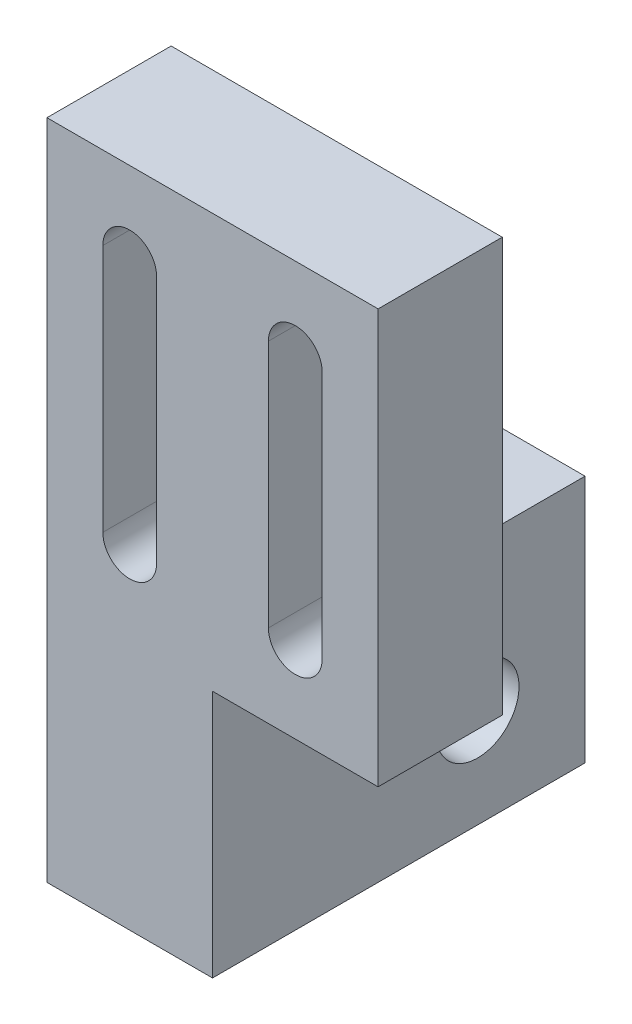
ISO-10303-21;
HEADER;
FILE_DESCRIPTION(('STEP AP214'),'2;1');
FILE_NAME('part.step','',(''),(''),'','','');
FILE_SCHEMA(('AUTOMOTIVE_DESIGN { 1 0 10303 214 1 1 1 1 }'));
ENDSEC;
DATA;
#1=APPLICATION_CONTEXT('core data for automotive mechanical design processes');
#2=APPLICATION_PROTOCOL_DEFINITION('international standard','automotive_design',2000,#1);
#3=PRODUCT_CONTEXT('',#1,'mechanical');
#4=PRODUCT('Part','Part','',(#3));
#5=PRODUCT_RELATED_PRODUCT_CATEGORY('part','',(#4));
#6=PRODUCT_DEFINITION_FORMATION('','',#4);
#7=PRODUCT_DEFINITION_CONTEXT('part definition',#1,'design');
#8=PRODUCT_DEFINITION('design','',#6,#7);
#9=PRODUCT_DEFINITION_SHAPE('','',#8);
#10=(LENGTH_UNIT() NAMED_UNIT(*) SI_UNIT(.MILLI.,.METRE.));
#11=(NAMED_UNIT(*) PLANE_ANGLE_UNIT() SI_UNIT($,.RADIAN.));
#12=(NAMED_UNIT(*) SI_UNIT($,.STERADIAN.) SOLID_ANGLE_UNIT());
#13=UNCERTAINTY_MEASURE_WITH_UNIT(LENGTH_MEASURE(1.E-05),#10,'distance_accuracy_value','');
#14=(GEOMETRIC_REPRESENTATION_CONTEXT(3) GLOBAL_UNCERTAINTY_ASSIGNED_CONTEXT((#13)) GLOBAL_UNIT_ASSIGNED_CONTEXT((#10,
#11,#12)) REPRESENTATION_CONTEXT('',''));
#15=CARTESIAN_POINT('',(0.,0.,0.));
#16=DIRECTION('',(0.,0.,1.));
#17=DIRECTION('',(1.,0.,0.));
#18=AXIS2_PLACEMENT_3D('',#15,#16,#17);
#19=CARTESIAN_POINT('',(-84.6,6.27000000000013,-9.));
#20=DIRECTION('',(0.,-1.,0.));
#21=DIRECTION('',(0.,0.,1.));
#22=AXIS2_PLACEMENT_3D('',#19,#20,#21);
#23=PLANE('',#22);
#24=DIRECTION('',(1.,0.,0.));
#25=VECTOR('',#24,1.);
#26=CARTESIAN_POINT('',(-84.6,6.27000000000013,-3.));
#27=LINE('',#26,#25);
#28=CARTESIAN_POINT('',(-84.6,6.27000000000013,-3.));
#29=VERTEX_POINT('',#28);
#30=CARTESIAN_POINT('',(-80.6,6.27000000000013,-3.));
#31=VERTEX_POINT('',#30);
#32=EDGE_CURVE('E226',#29,#31,#27,.T.);
#33=ORIENTED_EDGE('',*,*,#32,.T.);
#34=DIRECTION('',(0.,0.,1.));
#35=VECTOR('',#34,1.);
#36=CARTESIAN_POINT('',(-80.6,6.27000000000013,-9.));
#37=LINE('',#36,#35);
#38=CARTESIAN_POINT('',(-80.6,6.27000000000013,-9.));
#39=VERTEX_POINT('',#38);
#40=EDGE_CURVE('E272',#39,#31,#37,.T.);
#41=ORIENTED_EDGE('',*,*,#40,.F.);
#42=DIRECTION('',(-1.,0.,0.));
#43=VECTOR('',#42,1.);
#44=CARTESIAN_POINT('',(-84.6,6.27000000000013,-9.));
#45=LINE('',#44,#43);
#46=CARTESIAN_POINT('',(-84.6,6.27000000000013,-9.));
#47=VERTEX_POINT('',#46);
#48=EDGE_CURVE('E258',#39,#47,#45,.T.);
#49=ORIENTED_EDGE('',*,*,#48,.T.);
#50=DIRECTION('',(0.,0.,1.));
#51=VECTOR('',#50,1.);
#52=CARTESIAN_POINT('',(-84.6,6.27000000000013,-9.));
#53=LINE('',#52,#51);
#54=EDGE_CURVE('E261',#47,#29,#53,.T.);
#55=ORIENTED_EDGE('',*,*,#54,.T.);
#56=EDGE_LOOP('',(#33,#41,#49,#55));
#57=FACE_BOUND('',#56,.T.);
#58=ADVANCED_FACE('F37',(#57),#23,.F.);
#59=CARTESIAN_POINT('',(-84.6,6.27000000000013,-9.));
#60=DIRECTION('',(1.,0.,0.));
#61=DIRECTION('',(0.,0.,1.));
#62=AXIS2_PLACEMENT_3D('',#59,#60,#61);
#63=PLANE('',#62);
#64=CARTESIAN_POINT('',(-84.6,2.67000000000013,-6.40499999999975));
#65=DIRECTION('',(1.,0.,0.));
#66=DIRECTION('',(0.,0.,-1.));
#67=AXIS2_PLACEMENT_3D('',#64,#65,#66);
#68=CIRCLE('',#67,1.);
#69=CARTESIAN_POINT('',(-84.6,2.67000000000013,-7.40499999999975));
#70=VERTEX_POINT('',#69);
#71=EDGE_CURVE('E188',#70,#70,#68,.T.);
#72=ORIENTED_EDGE('',*,*,#71,.T.);
#73=EDGE_LOOP('',(#72));
#74=FACE_BOUND('',#73,.T.);
#75=DIRECTION('',(0.,-1.,0.));
#76=VECTOR('',#75,1.);
#77=CARTESIAN_POINT('',(-84.6,6.27000000000013,0.));
#78=LINE('',#77,#76);
#79=CARTESIAN_POINT('',(-84.6,16.2700000000001,0.));
#80=VERTEX_POINT('',#79);
#81=CARTESIAN_POINT('',(-84.6,0.270000000000126,0.));
#82=VERTEX_POINT('',#81);
#83=EDGE_CURVE('E248',#80,#82,#78,.T.);
#84=ORIENTED_EDGE('',*,*,#83,.F.);
#85=DIRECTION('',(0.,0.,1.));
#86=VECTOR('',#85,1.);
#87=CARTESIAN_POINT('',(-84.6,16.2700000000001,-3.));
#88=LINE('',#87,#86);
#89=CARTESIAN_POINT('',(-84.6,16.2700000000001,-3.));
#90=VERTEX_POINT('',#89);
#91=EDGE_CURVE('E234',#90,#80,#88,.T.);
#92=ORIENTED_EDGE('',*,*,#91,.F.);
#93=DIRECTION('',(0.,-1.,0.));
#94=VECTOR('',#93,1.);
#95=CARTESIAN_POINT('',(-84.6,6.27000000000013,-3.));
#96=LINE('',#95,#94);
#97=EDGE_CURVE('E222',#90,#29,#96,.T.);
#98=ORIENTED_EDGE('',*,*,#97,.T.);
#99=ORIENTED_EDGE('',*,*,#54,.F.);
#100=DIRECTION('',(0.,-1.,0.));
#101=VECTOR('',#100,1.);
#102=CARTESIAN_POINT('',(-84.6,6.27000000000013,-9.));
#103=LINE('',#102,#101);
#104=CARTESIAN_POINT('',(-84.6,0.270000000000126,-9.));
#105=VERTEX_POINT('',#104);
#106=EDGE_CURVE('E249',#47,#105,#103,.T.);
#107=ORIENTED_EDGE('',*,*,#106,.T.);
#108=DIRECTION('',(0.,0.,1.));
#109=VECTOR('',#108,1.);
#110=CARTESIAN_POINT('',(-84.6,0.270000000000126,-9.));
#111=LINE('',#110,#109);
#112=EDGE_CURVE('E11',#105,#82,#111,.T.);
#113=ORIENTED_EDGE('',*,*,#112,.T.);
#114=EDGE_LOOP('',(#84,#92,#98,#99,#107,#113));
#115=FACE_BOUND('',#114,.T.);
#116=ADVANCED_FACE('F39',(#74,#115),#63,.F.);
#117=CARTESIAN_POINT('',(-84.6,0.270000000000126,-9.));
#118=DIRECTION('',(0.,1.,0.));
#119=DIRECTION('',(0.,0.,-1.));
#120=AXIS2_PLACEMENT_3D('',#117,#118,#119);
#121=PLANE('',#120);
#122=DIRECTION('',(1.,0.,0.));
#123=VECTOR('',#122,1.);
#124=CARTESIAN_POINT('',(-84.6,0.270000000000126,0.));
#125=LINE('',#124,#123);
#126=CARTESIAN_POINT('',(-80.6,0.270000000000126,0.));
#127=VERTEX_POINT('',#126);
#128=EDGE_CURVE('E264',#82,#127,#125,.T.);
#129=ORIENTED_EDGE('',*,*,#128,.F.);
#130=ORIENTED_EDGE('',*,*,#112,.F.);
#131=DIRECTION('',(1.,0.,0.));
#132=VECTOR('',#131,1.);
#133=CARTESIAN_POINT('',(-84.6,0.270000000000126,-9.));
#134=LINE('',#133,#132);
#135=CARTESIAN_POINT('',(-80.6,0.270000000000126,-9.));
#136=VERTEX_POINT('',#135);
#137=EDGE_CURVE('E252',#105,#136,#134,.T.);
#138=ORIENTED_EDGE('',*,*,#137,.T.);
#139=DIRECTION('',(0.,0.,1.));
#140=VECTOR('',#139,1.);
#141=CARTESIAN_POINT('',(-80.6,0.270000000000126,-9.));
#142=LINE('',#141,#140);
#143=EDGE_CURVE('E46',#136,#127,#142,.T.);
#144=ORIENTED_EDGE('',*,*,#143,.T.);
#145=EDGE_LOOP('',(#129,#130,#138,#144));
#146=FACE_BOUND('',#145,.T.);
#147=ADVANCED_FACE('F278',(#146),#121,.F.);
#148=CARTESIAN_POINT('',(-80.6,6.27000000000013,-9.));
#149=DIRECTION('',(-1.,0.,0.));
#150=DIRECTION('',(0.,0.,-1.));
#151=AXIS2_PLACEMENT_3D('',#148,#149,#150);
#152=PLANE('',#151);
#153=CARTESIAN_POINT('',(-80.6,2.67000000000013,-6.40499999999975));
#154=DIRECTION('',(1.,0.,0.));
#155=DIRECTION('',(0.,0.,-1.));
#156=AXIS2_PLACEMENT_3D('',#153,#154,#155);
#157=CIRCLE('',#156,1.);
#158=CARTESIAN_POINT('',(-80.6,2.67000000000013,-7.40499999999975));
#159=VERTEX_POINT('',#158);
#160=EDGE_CURVE('E41',#159,#159,#157,.T.);
#161=ORIENTED_EDGE('',*,*,#160,.F.);
#162=EDGE_LOOP('',(#161));
#163=FACE_BOUND('',#162,.T.);
#164=DIRECTION('',(0.,1.,0.));
#165=VECTOR('',#164,1.);
#166=CARTESIAN_POINT('',(-80.6,6.27000000000013,0.));
#167=LINE('',#166,#165);
#168=CARTESIAN_POINT('',(-80.6,6.27000000000013,0.));
#169=VERTEX_POINT('',#168);
#170=EDGE_CURVE('E253',#127,#169,#167,.T.);
#171=ORIENTED_EDGE('',*,*,#170,.F.);
#172=ORIENTED_EDGE('',*,*,#143,.F.);
#173=DIRECTION('',(0.,1.,0.));
#174=VECTOR('',#173,1.);
#175=CARTESIAN_POINT('',(-80.6,6.27000000000013,-9.));
#176=LINE('',#175,#174);
#177=EDGE_CURVE('E256',#136,#39,#176,.T.);
#178=ORIENTED_EDGE('',*,*,#177,.T.);
#179=ORIENTED_EDGE('',*,*,#40,.T.);
#180=EDGE_CURVE('E271',#31,#169,#37,.T.);
#181=ORIENTED_EDGE('',*,*,#180,.T.);
#182=EDGE_LOOP('',(#171,#172,#178,#179,#181));
#183=FACE_BOUND('',#182,.T.);
#184=ADVANCED_FACE('F291',(#163,#183),#152,.F.);
#185=CARTESIAN_POINT('',(0.,0.,-9.));
#186=DIRECTION('',(0.,0.,-1.));
#187=DIRECTION('',(1.,0.,0.));
#188=AXIS2_PLACEMENT_3D('',#185,#186,#187);
#189=PLANE('',#188);
#190=ORIENTED_EDGE('',*,*,#106,.F.);
#191=ORIENTED_EDGE('',*,*,#48,.F.);
#192=ORIENTED_EDGE('',*,*,#177,.F.);
#193=ORIENTED_EDGE('',*,*,#137,.F.);
#194=EDGE_LOOP('',(#190,#191,#192,#193));
#195=FACE_BOUND('',#194,.T.);
#196=ADVANCED_FACE('F289',(#195),#189,.T.);
#197=CARTESIAN_POINT('',(0.,0.,0.));
#198=DIRECTION('',(0.,0.,-1.));
#199=DIRECTION('',(1.,0.,0.));
#200=AXIS2_PLACEMENT_3D('',#197,#198,#199);
#201=PLANE('',#200);
#202=DIRECTION('',(0.,-1.,0.));
#203=VECTOR('',#202,1.);
#204=CARTESIAN_POINT('',(-83.25,8.27000000000013,0.));
#205=LINE('',#204,#203);
#206=CARTESIAN_POINT('',(-83.25,14.2700000000001,0.));
#207=VERTEX_POINT('',#206);
#208=CARTESIAN_POINT('',(-83.25,8.27000000000013,0.));
#209=VERTEX_POINT('',#208);
#210=EDGE_CURVE('E160',#207,#209,#205,.T.);
#211=ORIENTED_EDGE('',*,*,#210,.F.);
#212=CARTESIAN_POINT('',(-82.6,14.2700000000001,0.));
#213=DIRECTION('',(0.,0.,1.));
#214=DIRECTION('',(1.,0.,0.));
#215=AXIS2_PLACEMENT_3D('',#212,#213,#214);
#216=CIRCLE('',#215,0.649999999999998);
#217=CARTESIAN_POINT('',(-81.95,14.2700000000001,0.));
#218=VERTEX_POINT('',#217);
#219=EDGE_CURVE('E173',#218,#207,#216,.T.);
#220=ORIENTED_EDGE('',*,*,#219,.F.);
#221=DIRECTION('',(0.,1.,0.));
#222=VECTOR('',#221,1.);
#223=CARTESIAN_POINT('',(-81.95,8.27000000000013,0.));
#224=LINE('',#223,#222);
#225=CARTESIAN_POINT('',(-81.95,8.27000000000013,0.));
#226=VERTEX_POINT('',#225);
#227=EDGE_CURVE('E153',#226,#218,#224,.T.);
#228=ORIENTED_EDGE('',*,*,#227,.F.);
#229=CARTESIAN_POINT('',(-82.6,8.27000000000013,0.));
#230=DIRECTION('',(0.,0.,1.));
#231=DIRECTION('',(1.,0.,0.));
#232=AXIS2_PLACEMENT_3D('',#229,#230,#231);
#233=CIRCLE('',#232,0.649999999999998);
#234=EDGE_CURVE('E163',#209,#226,#233,.T.);
#235=ORIENTED_EDGE('',*,*,#234,.F.);
#236=EDGE_LOOP('',(#211,#220,#228,#235));
#237=FACE_BOUND('',#236,.T.);
#238=DIRECTION('',(0.,1.,0.));
#239=VECTOR('',#238,1.);
#240=CARTESIAN_POINT('',(-77.95,14.2700000000001,0.));
#241=LINE('',#240,#239);
#242=CARTESIAN_POINT('',(-77.95,8.27000000000013,0.));
#243=VERTEX_POINT('',#242);
#244=CARTESIAN_POINT('',(-77.95,14.2700000000001,0.));
#245=VERTEX_POINT('',#244);
#246=EDGE_CURVE('E200',#243,#245,#241,.T.);
#247=ORIENTED_EDGE('',*,*,#246,.F.);
#248=CARTESIAN_POINT('',(-78.6,8.27000000000013,0.));
#249=DIRECTION('',(0.,0.,1.));
#250=DIRECTION('',(1.,0.,0.));
#251=AXIS2_PLACEMENT_3D('',#248,#249,#250);
#252=CIRCLE('',#251,0.649999999999998);
#253=CARTESIAN_POINT('',(-79.25,8.27000000000013,0.));
#254=VERTEX_POINT('',#253);
#255=EDGE_CURVE('E198',#254,#243,#252,.T.);
#256=ORIENTED_EDGE('',*,*,#255,.F.);
#257=DIRECTION('',(0.,-1.,0.));
#258=VECTOR('',#257,1.);
#259=CARTESIAN_POINT('',(-79.25,14.2700000000001,0.));
#260=LINE('',#259,#258);
#261=CARTESIAN_POINT('',(-79.25,14.2700000000001,0.));
#262=VERTEX_POINT('',#261);
#263=EDGE_CURVE('E195',#262,#254,#260,.T.);
#264=ORIENTED_EDGE('',*,*,#263,.F.);
#265=CARTESIAN_POINT('',(-78.6,14.2700000000001,0.));
#266=DIRECTION('',(0.,0.,1.));
#267=DIRECTION('',(1.,0.,0.));
#268=AXIS2_PLACEMENT_3D('',#265,#266,#267);
#269=CIRCLE('',#268,0.649999999999998);
#270=EDGE_CURVE('E192',#245,#262,#269,.T.);
#271=ORIENTED_EDGE('',*,*,#270,.F.);
#272=EDGE_LOOP('',(#247,#256,#264,#271));
#273=FACE_BOUND('',#272,.T.);
#274=ORIENTED_EDGE('',*,*,#83,.T.);
#275=ORIENTED_EDGE('',*,*,#128,.T.);
#276=ORIENTED_EDGE('',*,*,#170,.T.);
#277=DIRECTION('',(1.,0.,0.));
#278=VECTOR('',#277,1.);
#279=CARTESIAN_POINT('',(-84.6,6.27000000000013,0.));
#280=LINE('',#279,#278);
#281=CARTESIAN_POINT('',(-76.6,6.27000000000013,0.));
#282=VERTEX_POINT('',#281);
#283=EDGE_CURVE('E235',#169,#282,#280,.T.);
#284=ORIENTED_EDGE('',*,*,#283,.T.);
#285=DIRECTION('',(0.,1.,0.));
#286=VECTOR('',#285,1.);
#287=CARTESIAN_POINT('',(-76.6,6.27000000000013,0.));
#288=LINE('',#287,#286);
#289=CARTESIAN_POINT('',(-76.6,16.2700000000001,0.));
#290=VERTEX_POINT('',#289);
#291=EDGE_CURVE('E238',#282,#290,#288,.T.);
#292=ORIENTED_EDGE('',*,*,#291,.T.);
#293=DIRECTION('',(-1.,0.,0.));
#294=VECTOR('',#293,1.);
#295=CARTESIAN_POINT('',(-84.6,16.2700000000001,0.));
#296=LINE('',#295,#294);
#297=EDGE_CURVE('E225',#290,#80,#296,.T.);
#298=ORIENTED_EDGE('',*,*,#297,.T.);
#299=EDGE_LOOP('',(#274,#275,#276,#284,#292,#298));
#300=FACE_BOUND('',#299,.T.);
#301=ADVANCED_FACE('F171',(#237,#273,#300),#201,.F.);
#302=CARTESIAN_POINT('',(-84.6,6.27000000000013,-3.));
#303=DIRECTION('',(0.,1.,0.));
#304=DIRECTION('',(0.,0.,-1.));
#305=AXIS2_PLACEMENT_3D('',#302,#303,#304);
#306=PLANE('',#305);
#307=CARTESIAN_POINT('',(-76.6,6.27000000000013,-3.));
#308=VERTEX_POINT('',#307);
#309=EDGE_CURVE('E224',#31,#308,#27,.T.);
#310=ORIENTED_EDGE('',*,*,#309,.T.);
#311=DIRECTION('',(0.,0.,1.));
#312=VECTOR('',#311,1.);
#313=CARTESIAN_POINT('',(-76.6,6.27000000000013,-3.));
#314=LINE('',#313,#312);
#315=EDGE_CURVE('E246',#308,#282,#314,.T.);
#316=ORIENTED_EDGE('',*,*,#315,.T.);
#317=ORIENTED_EDGE('',*,*,#283,.F.);
#318=ORIENTED_EDGE('',*,*,#180,.F.);
#319=EDGE_LOOP('',(#310,#316,#317,#318));
#320=FACE_BOUND('',#319,.T.);
#321=ADVANCED_FACE('F302',(#320),#306,.F.);
#322=CARTESIAN_POINT('',(-76.6,6.27000000000013,-3.));
#323=DIRECTION('',(-1.,0.,0.));
#324=DIRECTION('',(0.,0.,-1.));
#325=AXIS2_PLACEMENT_3D('',#322,#323,#324);
#326=PLANE('',#325);
#327=ORIENTED_EDGE('',*,*,#291,.F.);
#328=ORIENTED_EDGE('',*,*,#315,.F.);
#329=DIRECTION('',(0.,1.,0.));
#330=VECTOR('',#329,1.);
#331=CARTESIAN_POINT('',(-76.6,6.27000000000013,-3.));
#332=LINE('',#331,#330);
#333=CARTESIAN_POINT('',(-76.6,16.2700000000001,-3.));
#334=VERTEX_POINT('',#333);
#335=EDGE_CURVE('E229',#308,#334,#332,.T.);
#336=ORIENTED_EDGE('',*,*,#335,.T.);
#337=DIRECTION('',(0.,0.,1.));
#338=VECTOR('',#337,1.);
#339=CARTESIAN_POINT('',(-76.6,16.2700000000001,-3.));
#340=LINE('',#339,#338);
#341=EDGE_CURVE('E244',#334,#290,#340,.T.);
#342=ORIENTED_EDGE('',*,*,#341,.T.);
#343=EDGE_LOOP('',(#327,#328,#336,#342));
#344=FACE_BOUND('',#343,.T.);
#345=ADVANCED_FACE('F305',(#344),#326,.F.);
#346=CARTESIAN_POINT('',(-84.6,16.2700000000001,-3.));
#347=DIRECTION('',(0.,-1.,0.));
#348=DIRECTION('',(0.,0.,1.));
#349=AXIS2_PLACEMENT_3D('',#346,#347,#348);
#350=PLANE('',#349);
#351=ORIENTED_EDGE('',*,*,#297,.F.);
#352=ORIENTED_EDGE('',*,*,#341,.F.);
#353=DIRECTION('',(-1.,0.,0.));
#354=VECTOR('',#353,1.);
#355=CARTESIAN_POINT('',(-84.6,16.2700000000001,-3.));
#356=LINE('',#355,#354);
#357=EDGE_CURVE('E232',#334,#90,#356,.T.);
#358=ORIENTED_EDGE('',*,*,#357,.T.);
#359=ORIENTED_EDGE('',*,*,#91,.T.);
#360=EDGE_LOOP('',(#351,#352,#358,#359));
#361=FACE_BOUND('',#360,.T.);
#362=ADVANCED_FACE('F308',(#361),#350,.F.);
#363=CARTESIAN_POINT('',(0.,0.,-3.));
#364=DIRECTION('',(0.,0.,1.));
#365=DIRECTION('',(-1.,0.,0.));
#366=AXIS2_PLACEMENT_3D('',#363,#364,#365);
#367=PLANE('',#366);
#368=DIRECTION('',(0.,1.,0.));
#369=VECTOR('',#368,1.);
#370=CARTESIAN_POINT('',(-81.95,8.27000000000013,-3.));
#371=LINE('',#370,#369);
#372=CARTESIAN_POINT('',(-81.95,8.27000000000013,-3.));
#373=VERTEX_POINT('',#372);
#374=CARTESIAN_POINT('',(-81.95,14.2700000000001,-3.));
#375=VERTEX_POINT('',#374);
#376=EDGE_CURVE('E156',#373,#375,#371,.T.);
#377=ORIENTED_EDGE('',*,*,#376,.T.);
#378=CARTESIAN_POINT('',(-82.6,14.2700000000001,-3.));
#379=DIRECTION('',(0.,0.,1.));
#380=DIRECTION('',(1.,0.,0.));
#381=AXIS2_PLACEMENT_3D('',#378,#379,#380);
#382=CIRCLE('',#381,0.649999999999998);
#383=CARTESIAN_POINT('',(-83.25,14.2700000000001,-3.));
#384=VERTEX_POINT('',#383);
#385=EDGE_CURVE('E182',#375,#384,#382,.T.);
#386=ORIENTED_EDGE('',*,*,#385,.T.);
#387=DIRECTION('',(0.,-1.,0.));
#388=VECTOR('',#387,1.);
#389=CARTESIAN_POINT('',(-83.25,8.27000000000013,-3.));
#390=LINE('',#389,#388);
#391=CARTESIAN_POINT('',(-83.25,8.27000000000013,-3.));
#392=VERTEX_POINT('',#391);
#393=EDGE_CURVE('E169',#384,#392,#390,.T.);
#394=ORIENTED_EDGE('',*,*,#393,.T.);
#395=CARTESIAN_POINT('',(-82.6,8.27000000000013,-3.));
#396=DIRECTION('',(0.,0.,1.));
#397=DIRECTION('',(1.,0.,0.));
#398=AXIS2_PLACEMENT_3D('',#395,#396,#397);
#399=CIRCLE('',#398,0.649999999999998);
#400=EDGE_CURVE('E178',#392,#373,#399,.T.);
#401=ORIENTED_EDGE('',*,*,#400,.T.);
#402=EDGE_LOOP('',(#377,#386,#394,#401));
#403=FACE_BOUND('',#402,.T.);
#404=DIRECTION('',(0.,-1.,0.));
#405=VECTOR('',#404,1.);
#406=CARTESIAN_POINT('',(-79.25,14.2700000000001,-3.));
#407=LINE('',#406,#405);
#408=CARTESIAN_POINT('',(-79.25,14.2700000000001,-3.));
#409=VERTEX_POINT('',#408);
#410=CARTESIAN_POINT('',(-79.25,8.27000000000013,-3.));
#411=VERTEX_POINT('',#410);
#412=EDGE_CURVE('E207',#409,#411,#407,.T.);
#413=ORIENTED_EDGE('',*,*,#412,.T.);
#414=CARTESIAN_POINT('',(-78.6,8.27000000000013,-3.));
#415=DIRECTION('',(0.,0.,1.));
#416=DIRECTION('',(1.,0.,0.));
#417=AXIS2_PLACEMENT_3D('',#414,#415,#416);
#418=CIRCLE('',#417,0.649999999999998);
#419=CARTESIAN_POINT('',(-77.95,8.27000000000013,-3.));
#420=VERTEX_POINT('',#419);
#421=EDGE_CURVE('E210',#411,#420,#418,.T.);
#422=ORIENTED_EDGE('',*,*,#421,.T.);
#423=DIRECTION('',(0.,1.,0.));
#424=VECTOR('',#423,1.);
#425=CARTESIAN_POINT('',(-77.95,14.2700000000001,-3.));
#426=LINE('',#425,#424);
#427=CARTESIAN_POINT('',(-77.95,14.2700000000001,-3.));
#428=VERTEX_POINT('',#427);
#429=EDGE_CURVE('E196',#420,#428,#426,.T.);
#430=ORIENTED_EDGE('',*,*,#429,.T.);
#431=CARTESIAN_POINT('',(-78.6,14.2700000000001,-3.));
#432=DIRECTION('',(0.,0.,1.));
#433=DIRECTION('',(1.,0.,0.));
#434=AXIS2_PLACEMENT_3D('',#431,#432,#433);
#435=CIRCLE('',#434,0.649999999999998);
#436=EDGE_CURVE('E204',#428,#409,#435,.T.);
#437=ORIENTED_EDGE('',*,*,#436,.T.);
#438=EDGE_LOOP('',(#413,#422,#430,#437));
#439=FACE_BOUND('',#438,.T.);
#440=ORIENTED_EDGE('',*,*,#97,.F.);
#441=ORIENTED_EDGE('',*,*,#357,.F.);
#442=ORIENTED_EDGE('',*,*,#335,.F.);
#443=ORIENTED_EDGE('',*,*,#309,.F.);
#444=ORIENTED_EDGE('',*,*,#32,.F.);
#445=EDGE_LOOP('',(#440,#441,#442,#443,#444));
#446=FACE_BOUND('',#445,.T.);
#447=ADVANCED_FACE('F298',(#403,#439,#446),#367,.F.);
#448=CARTESIAN_POINT('',(-76.6,2.67000000000013,-6.40499999999975));
#449=DIRECTION('',(-1.,0.,0.));
#450=DIRECTION('',(0.,0.,-1.));
#451=AXIS2_PLACEMENT_3D('',#448,#449,#450);
#452=CYLINDRICAL_SURFACE('',#451,1.);
#453=ORIENTED_EDGE('',*,*,#71,.F.);
#454=EDGE_LOOP('',(#453));
#455=FACE_BOUND('',#454,.T.);
#456=ORIENTED_EDGE('',*,*,#160,.T.);
#457=EDGE_LOOP('',(#456));
#458=FACE_BOUND('',#457,.T.);
#459=ADVANCED_FACE('F315',(#455,#458),#452,.F.);
#460=CARTESIAN_POINT('',(-78.6,14.2700000000001,0.));
#461=DIRECTION('',(0.,0.,-1.));
#462=DIRECTION('',(1.,0.,0.));
#463=AXIS2_PLACEMENT_3D('',#460,#461,#462);
#464=CYLINDRICAL_SURFACE('',#463,0.649999999999998);
#465=ORIENTED_EDGE('',*,*,#436,.F.);
#466=DIRECTION('',(0.,0.,-1.));
#467=VECTOR('',#466,1.);
#468=CARTESIAN_POINT('',(-77.95,14.2700000000001,0.));
#469=LINE('',#468,#467);
#470=EDGE_CURVE('E180',#245,#428,#469,.T.);
#471=ORIENTED_EDGE('',*,*,#470,.F.);
#472=ORIENTED_EDGE('',*,*,#270,.T.);
#473=DIRECTION('',(0.,0.,-1.));
#474=VECTOR('',#473,1.);
#475=CARTESIAN_POINT('',(-79.25,14.2700000000001,0.));
#476=LINE('',#475,#474);
#477=EDGE_CURVE('E203',#262,#409,#476,.T.);
#478=ORIENTED_EDGE('',*,*,#477,.T.);
#479=EDGE_LOOP('',(#465,#471,#472,#478));
#480=FACE_BOUND('',#479,.T.);
#481=ADVANCED_FACE('F379',(#480),#464,.F.);
#482=CARTESIAN_POINT('',(-77.95,14.2700000000001,0.));
#483=DIRECTION('',(1.,0.,0.));
#484=DIRECTION('',(0.,0.,1.));
#485=AXIS2_PLACEMENT_3D('',#482,#483,#484);
#486=PLANE('',#485);
#487=ORIENTED_EDGE('',*,*,#429,.F.);
#488=DIRECTION('',(0.,0.,-1.));
#489=VECTOR('',#488,1.);
#490=CARTESIAN_POINT('',(-77.95,8.27000000000013,0.));
#491=LINE('',#490,#489);
#492=EDGE_CURVE('E216',#243,#420,#491,.T.);
#493=ORIENTED_EDGE('',*,*,#492,.F.);
#494=ORIENTED_EDGE('',*,*,#246,.T.);
#495=ORIENTED_EDGE('',*,*,#470,.T.);
#496=EDGE_LOOP('',(#487,#493,#494,#495));
#497=FACE_BOUND('',#496,.T.);
#498=ADVANCED_FACE('F389',(#497),#486,.F.);
#499=CARTESIAN_POINT('',(-78.6,8.27000000000013,0.));
#500=DIRECTION('',(0.,0.,-1.));
#501=DIRECTION('',(1.,0.,0.));
#502=AXIS2_PLACEMENT_3D('',#499,#500,#501);
#503=CYLINDRICAL_SURFACE('',#502,0.649999999999998);
#504=ORIENTED_EDGE('',*,*,#421,.F.);
#505=DIRECTION('',(0.,0.,-1.));
#506=VECTOR('',#505,1.);
#507=CARTESIAN_POINT('',(-79.25,8.27000000000013,0.));
#508=LINE('',#507,#506);
#509=EDGE_CURVE('E61',#254,#411,#508,.T.);
#510=ORIENTED_EDGE('',*,*,#509,.F.);
#511=ORIENTED_EDGE('',*,*,#255,.T.);
#512=ORIENTED_EDGE('',*,*,#492,.T.);
#513=EDGE_LOOP('',(#504,#510,#511,#512));
#514=FACE_BOUND('',#513,.T.);
#515=ADVANCED_FACE('F399',(#514),#503,.F.);
#516=CARTESIAN_POINT('',(-79.25,14.2700000000001,0.));
#517=DIRECTION('',(-1.,0.,0.));
#518=DIRECTION('',(0.,0.,-1.));
#519=AXIS2_PLACEMENT_3D('',#516,#517,#518);
#520=PLANE('',#519);
#521=ORIENTED_EDGE('',*,*,#412,.F.);
#522=ORIENTED_EDGE('',*,*,#477,.F.);
#523=ORIENTED_EDGE('',*,*,#263,.T.);
#524=ORIENTED_EDGE('',*,*,#509,.T.);
#525=EDGE_LOOP('',(#521,#522,#523,#524));
#526=FACE_BOUND('',#525,.T.);
#527=ADVANCED_FACE('F409',(#526),#520,.F.);
#528=CARTESIAN_POINT('',(-82.6,8.27000000000013,0.));
#529=DIRECTION('',(0.,0.,-1.));
#530=DIRECTION('',(1.,0.,0.));
#531=AXIS2_PLACEMENT_3D('',#528,#529,#530);
#532=CYLINDRICAL_SURFACE('',#531,0.649999999999998);
#533=ORIENTED_EDGE('',*,*,#400,.F.);
#534=DIRECTION('',(0.,0.,-1.));
#535=VECTOR('',#534,1.);
#536=CARTESIAN_POINT('',(-83.25,8.27000000000013,0.));
#537=LINE('',#536,#535);
#538=EDGE_CURVE('E165',#209,#392,#537,.T.);
#539=ORIENTED_EDGE('',*,*,#538,.F.);
#540=ORIENTED_EDGE('',*,*,#234,.T.);
#541=DIRECTION('',(0.,0.,-1.));
#542=VECTOR('',#541,1.);
#543=CARTESIAN_POINT('',(-81.95,8.27000000000013,0.));
#544=LINE('',#543,#542);
#545=EDGE_CURVE('E149',#226,#373,#544,.T.);
#546=ORIENTED_EDGE('',*,*,#545,.T.);
#547=EDGE_LOOP('',(#533,#539,#540,#546));
#548=FACE_BOUND('',#547,.T.);
#549=ADVANCED_FACE('F164',(#548),#532,.F.);
#550=CARTESIAN_POINT('',(-83.25,8.27000000000013,0.));
#551=DIRECTION('',(-1.,0.,0.));
#552=DIRECTION('',(0.,0.,-1.));
#553=AXIS2_PLACEMENT_3D('',#550,#551,#552);
#554=PLANE('',#553);
#555=ORIENTED_EDGE('',*,*,#393,.F.);
#556=DIRECTION('',(0.,0.,-1.));
#557=VECTOR('',#556,1.);
#558=CARTESIAN_POINT('',(-83.25,14.2700000000001,0.));
#559=LINE('',#558,#557);
#560=EDGE_CURVE('E189',#207,#384,#559,.T.);
#561=ORIENTED_EDGE('',*,*,#560,.F.);
#562=ORIENTED_EDGE('',*,*,#210,.T.);
#563=ORIENTED_EDGE('',*,*,#538,.T.);
#564=EDGE_LOOP('',(#555,#561,#562,#563));
#565=FACE_BOUND('',#564,.T.);
#566=ADVANCED_FACE('F427',(#565),#554,.F.);
#567=CARTESIAN_POINT('',(-82.6,14.2700000000001,0.));
#568=DIRECTION('',(0.,0.,-1.));
#569=DIRECTION('',(1.,0.,0.));
#570=AXIS2_PLACEMENT_3D('',#567,#568,#569);
#571=CYLINDRICAL_SURFACE('',#570,0.649999999999998);
#572=ORIENTED_EDGE('',*,*,#385,.F.);
#573=DIRECTION('',(0.,0.,-1.));
#574=VECTOR('',#573,1.);
#575=CARTESIAN_POINT('',(-81.95,14.2700000000001,0.));
#576=LINE('',#575,#574);
#577=EDGE_CURVE('E53',#218,#375,#576,.T.);
#578=ORIENTED_EDGE('',*,*,#577,.F.);
#579=ORIENTED_EDGE('',*,*,#219,.T.);
#580=ORIENTED_EDGE('',*,*,#560,.T.);
#581=EDGE_LOOP('',(#572,#578,#579,#580));
#582=FACE_BOUND('',#581,.T.);
#583=ADVANCED_FACE('F436',(#582),#571,.F.);
#584=CARTESIAN_POINT('',(-81.95,8.27000000000013,0.));
#585=DIRECTION('',(1.,0.,0.));
#586=DIRECTION('',(0.,0.,1.));
#587=AXIS2_PLACEMENT_3D('',#584,#585,#586);
#588=PLANE('',#587);
#589=ORIENTED_EDGE('',*,*,#376,.F.);
#590=ORIENTED_EDGE('',*,*,#545,.F.);
#591=ORIENTED_EDGE('',*,*,#227,.T.);
#592=ORIENTED_EDGE('',*,*,#577,.T.);
#593=EDGE_LOOP('',(#589,#590,#591,#592));
#594=FACE_BOUND('',#593,.T.);
#595=ADVANCED_FACE('F151',(#594),#588,.F.);
#596=CLOSED_SHELL('',(#58,#116,#147,#184,#196,#301,#321,#345,#362,#447,#459,#481,#498,#515,#527,
#549,#566,#583,#595));
#597=MANIFOLD_SOLID_BREP('B2',#596);
#598=ADVANCED_BREP_SHAPE_REPRESENTATION('',(#18,#597),#14);
#599=SHAPE_DEFINITION_REPRESENTATION(#9,#598);
ENDSEC;
END-ISO-10303-21;
